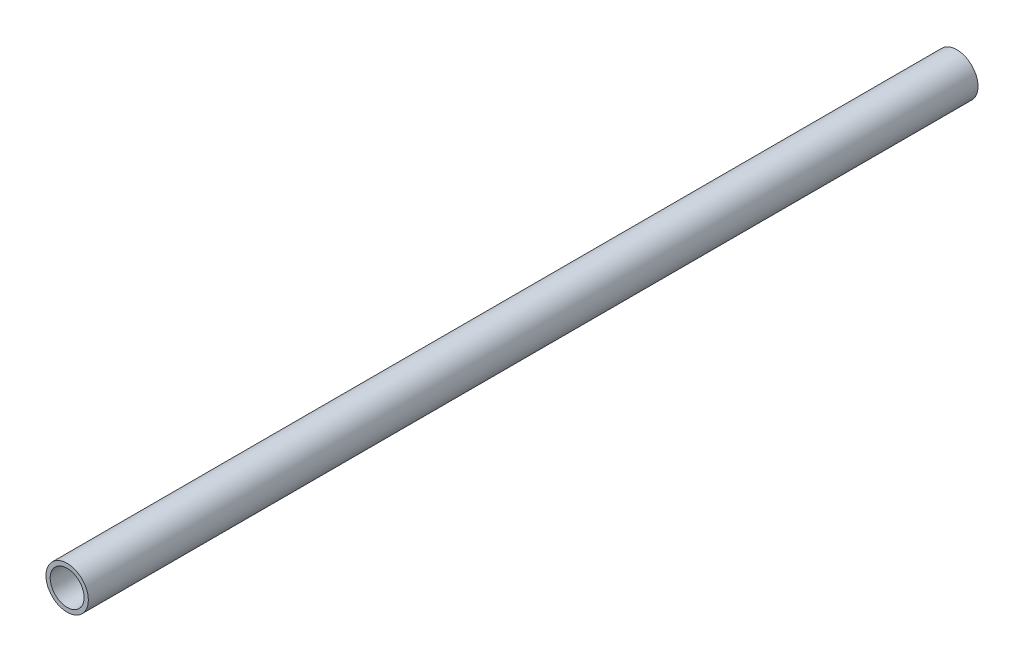
ISO-10303-21;
HEADER;
FILE_DESCRIPTION(('STEP AP214'),'2;1');
FILE_NAME('part.step','',(''),(''),'','','');
FILE_SCHEMA(('AUTOMOTIVE_DESIGN { 1 0 10303 214 1 1 1 1 }'));
ENDSEC;
DATA;
#1=APPLICATION_CONTEXT('core data for automotive mechanical design processes');
#2=APPLICATION_PROTOCOL_DEFINITION('international standard','automotive_design',2000,#1);
#3=PRODUCT_CONTEXT('',#1,'mechanical');
#4=PRODUCT('Part','Part','',(#3));
#5=PRODUCT_RELATED_PRODUCT_CATEGORY('part','',(#4));
#6=PRODUCT_DEFINITION_FORMATION('','',#4);
#7=PRODUCT_DEFINITION_CONTEXT('part definition',#1,'design');
#8=PRODUCT_DEFINITION('design','',#6,#7);
#9=PRODUCT_DEFINITION_SHAPE('','',#8);
#10=(LENGTH_UNIT() NAMED_UNIT(*) SI_UNIT(.MILLI.,.METRE.));
#11=(NAMED_UNIT(*) PLANE_ANGLE_UNIT() SI_UNIT($,.RADIAN.));
#12=(NAMED_UNIT(*) SI_UNIT($,.STERADIAN.) SOLID_ANGLE_UNIT());
#13=UNCERTAINTY_MEASURE_WITH_UNIT(LENGTH_MEASURE(1.E-05),#10,'distance_accuracy_value','');
#14=(GEOMETRIC_REPRESENTATION_CONTEXT(3) GLOBAL_UNCERTAINTY_ASSIGNED_CONTEXT((#13)) GLOBAL_UNIT_ASSIGNED_CONTEXT((#10,
#11,#12)) REPRESENTATION_CONTEXT('',''));
#15=CARTESIAN_POINT('',(0.,0.,0.));
#16=DIRECTION('',(0.,0.,1.));
#17=DIRECTION('',(1.,0.,0.));
#18=AXIS2_PLACEMENT_3D('',#15,#16,#17);
#19=CARTESIAN_POINT('',(0.,0.,210.));
#20=DIRECTION('',(0.,0.,-1.));
#21=DIRECTION('',(-1.,0.,0.));
#22=AXIS2_PLACEMENT_3D('',#19,#20,#21);
#23=CYLINDRICAL_SURFACE('',#22,5.);
#24=CARTESIAN_POINT('',(0.,0.,210.));
#25=DIRECTION('',(0.,0.,1.));
#26=DIRECTION('',(1.,0.,0.));
#27=AXIS2_PLACEMENT_3D('',#24,#25,#26);
#28=CIRCLE('',#27,5.);
#29=CARTESIAN_POINT('',(5.,0.,210.));
#30=VERTEX_POINT('',#29);
#31=EDGE_CURVE('E10',#30,#30,#28,.T.);
#32=ORIENTED_EDGE('',*,*,#31,.F.);
#33=EDGE_LOOP('',(#32));
#34=FACE_BOUND('',#33,.T.);
#35=CARTESIAN_POINT('',(0.,0.,0.));
#36=DIRECTION('',(0.,0.,1.));
#37=DIRECTION('',(1.,0.,0.));
#38=AXIS2_PLACEMENT_3D('',#35,#36,#37);
#39=CIRCLE('',#38,5.);
#40=CARTESIAN_POINT('',(5.,0.,0.));
#41=VERTEX_POINT('',#40);
#42=EDGE_CURVE('E44',#41,#41,#39,.T.);
#43=ORIENTED_EDGE('',*,*,#42,.T.);
#44=EDGE_LOOP('',(#43));
#45=FACE_BOUND('',#44,.T.);
#46=ADVANCED_FACE('F41',(#34,#45),#23,.T.);
#47=CARTESIAN_POINT('',(0.,0.,210.));
#48=DIRECTION('',(0.,0.,1.));
#49=DIRECTION('',(1.,0.,0.));
#50=AXIS2_PLACEMENT_3D('',#47,#48,#49);
#51=PLANE('',#50);
#52=CARTESIAN_POINT('',(0.,0.,210.));
#53=DIRECTION('',(0.,0.,1.));
#54=DIRECTION('',(1.,0.,0.));
#55=AXIS2_PLACEMENT_3D('',#52,#53,#54);
#56=CIRCLE('',#55,4.);
#57=CARTESIAN_POINT('',(4.,0.,210.));
#58=VERTEX_POINT('',#57);
#59=EDGE_CURVE('E51',#58,#58,#56,.T.);
#60=ORIENTED_EDGE('',*,*,#59,.F.);
#61=EDGE_LOOP('',(#60));
#62=FACE_BOUND('',#61,.T.);
#63=ORIENTED_EDGE('',*,*,#31,.T.);
#64=EDGE_LOOP('',(#63));
#65=FACE_BOUND('',#64,.T.);
#66=ADVANCED_FACE('F64',(#62,#65),#51,.T.);
#67=CARTESIAN_POINT('',(0.,0.,0.));
#68=DIRECTION('',(0.,0.,1.));
#69=DIRECTION('',(1.,0.,0.));
#70=AXIS2_PLACEMENT_3D('',#67,#68,#69);
#71=PLANE('',#70);
#72=CARTESIAN_POINT('',(0.,0.,0.));
#73=DIRECTION('',(0.,0.,1.));
#74=DIRECTION('',(1.,0.,0.));
#75=AXIS2_PLACEMENT_3D('',#72,#73,#74);
#76=CIRCLE('',#75,4.);
#77=CARTESIAN_POINT('',(4.,0.,0.));
#78=VERTEX_POINT('',#77);
#79=EDGE_CURVE('E55',#78,#78,#76,.F.);
#80=ORIENTED_EDGE('',*,*,#79,.F.);
#81=EDGE_LOOP('',(#80));
#82=FACE_BOUND('',#81,.T.);
#83=ORIENTED_EDGE('',*,*,#42,.F.);
#84=EDGE_LOOP('',(#83));
#85=FACE_BOUND('',#84,.T.);
#86=ADVANCED_FACE('F61',(#82,#85),#71,.F.);
#87=CARTESIAN_POINT('',(0.,0.,210.));
#88=DIRECTION('',(0.,0.,-1.));
#89=DIRECTION('',(-1.,0.,0.));
#90=AXIS2_PLACEMENT_3D('',#87,#88,#89);
#91=CYLINDRICAL_SURFACE('',#90,4.);
#92=ORIENTED_EDGE('',*,*,#59,.T.);
#93=EDGE_LOOP('',(#92));
#94=FACE_BOUND('',#93,.T.);
#95=ORIENTED_EDGE('',*,*,#79,.T.);
#96=EDGE_LOOP('',(#95));
#97=FACE_BOUND('',#96,.T.);
#98=ADVANCED_FACE('F59',(#94,#97),#91,.F.);
#99=CLOSED_SHELL('',(#46,#66,#86,#98));
#100=MANIFOLD_SOLID_BREP('B2',#99);
#101=ADVANCED_BREP_SHAPE_REPRESENTATION('',(#18,#100),#14);
#102=SHAPE_DEFINITION_REPRESENTATION(#9,#101);
ENDSEC;
END-ISO-10303-21;
